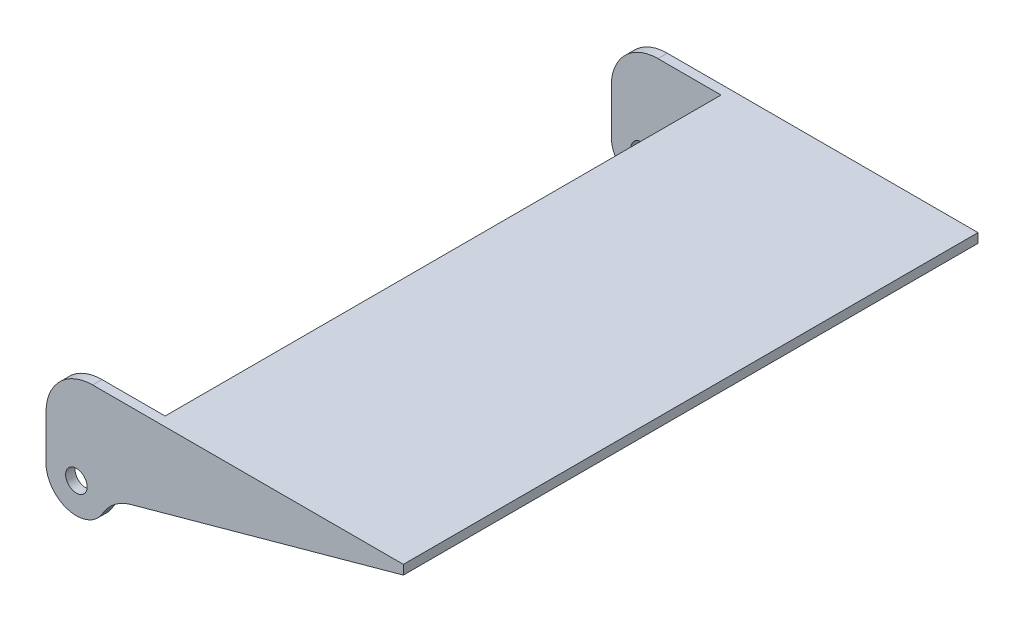
ISO-10303-21;
HEADER;
FILE_DESCRIPTION(('STEP AP214'),'2;1');
FILE_NAME('part.step','',(''),(''),'','','');
FILE_SCHEMA(('AUTOMOTIVE_DESIGN { 1 0 10303 214 1 1 1 1 }'));
ENDSEC;
DATA;
#1=APPLICATION_CONTEXT('core data for automotive mechanical design processes');
#2=APPLICATION_PROTOCOL_DEFINITION('international standard','automotive_design',2000,#1);
#3=PRODUCT_CONTEXT('',#1,'mechanical');
#4=PRODUCT('Part','Part','',(#3));
#5=PRODUCT_RELATED_PRODUCT_CATEGORY('part','',(#4));
#6=PRODUCT_DEFINITION_FORMATION('','',#4);
#7=PRODUCT_DEFINITION_CONTEXT('part definition',#1,'design');
#8=PRODUCT_DEFINITION('design','',#6,#7);
#9=PRODUCT_DEFINITION_SHAPE('','',#8);
#10=(LENGTH_UNIT() NAMED_UNIT(*) SI_UNIT(.MILLI.,.METRE.));
#11=(NAMED_UNIT(*) PLANE_ANGLE_UNIT() SI_UNIT($,.RADIAN.));
#12=(NAMED_UNIT(*) SI_UNIT($,.STERADIAN.) SOLID_ANGLE_UNIT());
#13=UNCERTAINTY_MEASURE_WITH_UNIT(LENGTH_MEASURE(1.E-05),#10,'distance_accuracy_value','');
#14=(GEOMETRIC_REPRESENTATION_CONTEXT(3) GLOBAL_UNCERTAINTY_ASSIGNED_CONTEXT((#13)) GLOBAL_UNIT_ASSIGNED_CONTEXT((#10,
#11,#12)) REPRESENTATION_CONTEXT('',''));
#15=CARTESIAN_POINT('',(0.,0.,0.));
#16=DIRECTION('',(0.,0.,1.));
#17=DIRECTION('',(1.,0.,0.));
#18=AXIS2_PLACEMENT_3D('',#15,#16,#17);
#19=CARTESIAN_POINT('',(-41.5004986708684,-8.,-142.298219213207));
#20=DIRECTION('',(0.,0.,1.));
#21=DIRECTION('',(1.,0.,0.));
#22=AXIS2_PLACEMENT_3D('',#19,#20,#21);
#23=CYLINDRICAL_SURFACE('',#22,10.);
#24=DIRECTION('',(0.,0.,1.));
#25=VECTOR('',#24,1.);
#26=CARTESIAN_POINT('',(-41.5004986708684,2.00000000000001,-142.298219213207));
#27=LINE('',#26,#25);
#28=CARTESIAN_POINT('',(-41.5004986708684,2.00000000000001,59.5));
#29=VERTEX_POINT('',#28);
#30=CARTESIAN_POINT('',(-41.5004986708684,2.00000000000001,61.5));
#31=VERTEX_POINT('',#30);
#32=EDGE_CURVE('E221',#29,#31,#27,.T.);
#33=ORIENTED_EDGE('',*,*,#32,.F.);
#34=CARTESIAN_POINT('',(-41.5004986708684,-8.,59.5));
#35=DIRECTION('',(0.,0.,1.));
#36=DIRECTION('',(1.,0.,0.));
#37=AXIS2_PLACEMENT_3D('',#34,#35,#36);
#38=CIRCLE('',#37,10.);
#39=CARTESIAN_POINT('',(-51.5004986708684,-8.,59.5));
#40=VERTEX_POINT('',#39);
#41=EDGE_CURVE('E182',#40,#29,#38,.F.);
#42=ORIENTED_EDGE('',*,*,#41,.F.);
#43=DIRECTION('',(0.,0.,1.));
#44=VECTOR('',#43,1.);
#45=CARTESIAN_POINT('',(-51.5004986708684,-8.,-142.298219213207));
#46=LINE('',#45,#44);
#47=CARTESIAN_POINT('',(-51.5004986708684,-8.,61.5));
#48=VERTEX_POINT('',#47);
#49=EDGE_CURVE('E217',#40,#48,#46,.T.);
#50=ORIENTED_EDGE('',*,*,#49,.T.);
#51=CARTESIAN_POINT('',(-41.5004986708684,-8.,61.5));
#52=DIRECTION('',(0.,0.,1.));
#53=DIRECTION('',(1.,0.,0.));
#54=AXIS2_PLACEMENT_3D('',#51,#52,#53);
#55=CIRCLE('',#54,10.);
#56=EDGE_CURVE('E204',#31,#48,#55,.T.);
#57=ORIENTED_EDGE('',*,*,#56,.F.);
#58=EDGE_LOOP('',(#33,#42,#50,#57));
#59=FACE_BOUND('',#58,.T.);
#60=ADVANCED_FACE('F33',(#59),#23,.T.);
#61=CARTESIAN_POINT('',(-45.,-17.5,-142.298219213207));
#62=DIRECTION('',(0.,0.,1.));
#63=DIRECTION('',(1.,0.,0.));
#64=AXIS2_PLACEMENT_3D('',#61,#62,#63);
#65=CYLINDRICAL_SURFACE('',#64,6.5004986708684);
#66=CARTESIAN_POINT('',(-45.,-17.5,59.5));
#67=DIRECTION('',(0.,0.,1.));
#68=DIRECTION('',(1.,0.,0.));
#69=AXIS2_PLACEMENT_3D('',#66,#67,#68);
#70=CIRCLE('',#69,6.5004986708684);
#71=CARTESIAN_POINT('',(-39.3638938716402,-20.7389490085253,59.5));
#72=VERTEX_POINT('',#71);
#73=CARTESIAN_POINT('',(-51.5004986708684,-17.5,59.5));
#74=VERTEX_POINT('',#73);
#75=EDGE_CURVE('E180',#72,#74,#70,.F.);
#76=ORIENTED_EDGE('',*,*,#75,.F.);
#77=DIRECTION('',(0.,0.,1.));
#78=VECTOR('',#77,1.);
#79=CARTESIAN_POINT('',(-39.3638938716402,-20.7389490085253,-142.298219213207));
#80=LINE('',#79,#78);
#81=CARTESIAN_POINT('',(-39.3638938716402,-20.7389490085253,61.5));
#82=VERTEX_POINT('',#81);
#83=EDGE_CURVE('E210',#72,#82,#80,.T.);
#84=ORIENTED_EDGE('',*,*,#83,.T.);
#85=CARTESIAN_POINT('',(-45.,-17.5,61.5));
#86=DIRECTION('',(0.,0.,1.));
#87=DIRECTION('',(1.,0.,0.));
#88=AXIS2_PLACEMENT_3D('',#85,#86,#87);
#89=CIRCLE('',#88,6.5004986708684);
#90=CARTESIAN_POINT('',(-51.5004986708684,-17.5,61.5));
#91=VERTEX_POINT('',#90);
#92=EDGE_CURVE('E184',#91,#82,#89,.T.);
#93=ORIENTED_EDGE('',*,*,#92,.F.);
#94=DIRECTION('',(0.,0.,1.));
#95=VECTOR('',#94,1.);
#96=CARTESIAN_POINT('',(-51.5004986708684,-17.5,-142.298219213207));
#97=LINE('',#96,#95);
#98=EDGE_CURVE('E213',#74,#91,#97,.T.);
#99=ORIENTED_EDGE('',*,*,#98,.F.);
#100=EDGE_LOOP('',(#76,#84,#93,#99));
#101=FACE_BOUND('',#100,.T.);
#102=ADVANCED_FACE('F310',(#101),#65,.T.);
#103=CARTESIAN_POINT('',(-51.5004986708684,-8.,-142.298219213207));
#104=DIRECTION('',(-1.,0.,0.));
#105=DIRECTION('',(0.,-1.,0.));
#106=AXIS2_PLACEMENT_3D('',#103,#104,#105);
#107=PLANE('',#106);
#108=DIRECTION('',(0.,-1.,0.));
#109=VECTOR('',#108,1.);
#110=CARTESIAN_POINT('',(-51.5004986708684,0.,59.5));
#111=LINE('',#110,#109);
#112=EDGE_CURVE('E171',#40,#74,#111,.T.);
#113=ORIENTED_EDGE('',*,*,#112,.T.);
#114=ORIENTED_EDGE('',*,*,#98,.T.);
#115=DIRECTION('',(0.,-1.,0.));
#116=VECTOR('',#115,1.);
#117=CARTESIAN_POINT('',(-51.5004986708684,-8.,61.5));
#118=LINE('',#117,#116);
#119=EDGE_CURVE('E207',#48,#91,#118,.T.);
#120=ORIENTED_EDGE('',*,*,#119,.F.);
#121=ORIENTED_EDGE('',*,*,#49,.F.);
#122=EDGE_LOOP('',(#113,#114,#120,#121));
#123=FACE_BOUND('',#122,.T.);
#124=ADVANCED_FACE('F316',(#123),#107,.T.);
#125=CARTESIAN_POINT('',(25.,0.,-142.298219213207));
#126=DIRECTION('',(0.265687680652756,-0.964059156042491,0.));
#127=DIRECTION('',(0.964059156042491,0.265687680652756,0.));
#128=AXIS2_PLACEMENT_3D('',#125,#126,#127);
#129=PLANE('',#128);
#130=DIRECTION('',(-0.964059156042491,-0.265687680652756,0.));
#131=VECTOR('',#130,1.);
#132=CARTESIAN_POINT('',(25.,0.,59.5));
#133=LINE('',#132,#131);
#134=CARTESIAN_POINT('',(25.,0.,59.5));
#135=VERTEX_POINT('',#134);
#136=CARTESIAN_POINT('',(-33.3505033437282,-16.0809736634385,59.5));
#137=VERTEX_POINT('',#136);
#138=EDGE_CURVE('E178',#135,#137,#133,.T.);
#139=ORIENTED_EDGE('',*,*,#138,.F.);
#140=DIRECTION('',(0.,0.,-1.));
#141=VECTOR('',#140,1.);
#142=CARTESIAN_POINT('',(25.,0.,61.5));
#143=LINE('',#142,#141);
#144=CARTESIAN_POINT('',(25.,0.,61.5));
#145=VERTEX_POINT('',#144);
#146=EDGE_CURVE('E234',#145,#135,#143,.T.);
#147=ORIENTED_EDGE('',*,*,#146,.F.);
#148=DIRECTION('',(0.96405915604249,0.265687680652756,0.));
#149=VECTOR('',#148,1.);
#150=CARTESIAN_POINT('',(25.,0.,61.5));
#151=LINE('',#150,#149);
#152=CARTESIAN_POINT('',(-33.3505033437282,-16.0809736634385,61.5));
#153=VERTEX_POINT('',#152);
#154=EDGE_CURVE('E201',#153,#145,#151,.T.);
#155=ORIENTED_EDGE('',*,*,#154,.F.);
#156=DIRECTION('',(0.,0.,1.));
#157=VECTOR('',#156,1.);
#158=CARTESIAN_POINT('',(-33.3505033437282,-16.0809736634385,-142.298219213207));
#159=LINE('',#158,#157);
#160=EDGE_CURVE('E225',#137,#153,#159,.T.);
#161=ORIENTED_EDGE('',*,*,#160,.F.);
#162=EDGE_LOOP('',(#139,#147,#155,#161));
#163=FACE_BOUND('',#162,.T.);
#164=ADVANCED_FACE('F327',(#163),#129,.T.);
#165=CARTESIAN_POINT('',(-30.6936265372007,-25.7215652238634,-142.298219213207));
#166=DIRECTION('',(0.,0.,1.));
#167=DIRECTION('',(1.,0.,0.));
#168=AXIS2_PLACEMENT_3D('',#165,#166,#167);
#169=CYLINDRICAL_SURFACE('',#168,10.);
#170=CARTESIAN_POINT('',(-30.6936265372007,-25.7215652238634,59.5));
#171=DIRECTION('',(0.,0.,1.));
#172=DIRECTION('',(1.,0.,0.));
#173=AXIS2_PLACEMENT_3D('',#170,#171,#172);
#174=CIRCLE('',#173,10.);
#175=EDGE_CURVE('E11',#137,#72,#174,.T.);
#176=ORIENTED_EDGE('',*,*,#175,.F.);
#177=ORIENTED_EDGE('',*,*,#160,.T.);
#178=CARTESIAN_POINT('',(-30.6936265372007,-25.7215652238634,61.5));
#179=DIRECTION('',(0.,0.,-1.));
#180=DIRECTION('',(-1.,0.,0.));
#181=AXIS2_PLACEMENT_3D('',#178,#179,#180);
#182=CIRCLE('',#181,10.);
#183=EDGE_CURVE('E198',#82,#153,#182,.T.);
#184=ORIENTED_EDGE('',*,*,#183,.F.);
#185=ORIENTED_EDGE('',*,*,#83,.F.);
#186=EDGE_LOOP('',(#176,#177,#184,#185));
#187=FACE_BOUND('',#186,.T.);
#188=ADVANCED_FACE('F337',(#187),#169,.F.);
#189=CARTESIAN_POINT('',(25.,2.,61.5));
#190=DIRECTION('',(-1.,0.,0.));
#191=DIRECTION('',(0.,0.,1.));
#192=AXIS2_PLACEMENT_3D('',#189,#190,#191);
#193=PLANE('',#192);
#194=ORIENTED_EDGE('',*,*,#146,.T.);
#195=DIRECTION('',(0.,0.,1.));
#196=VECTOR('',#195,1.);
#197=CARTESIAN_POINT('',(25.,0.,59.5));
#198=LINE('',#197,#196);
#199=CARTESIAN_POINT('',(25.,0.,-59.5));
#200=VERTEX_POINT('',#199);
#201=EDGE_CURVE('E273',#200,#135,#198,.T.);
#202=ORIENTED_EDGE('',*,*,#201,.F.);
#203=CARTESIAN_POINT('',(25.,0.,-61.5));
#204=VERTEX_POINT('',#203);
#205=EDGE_CURVE('E230',#200,#204,#143,.T.);
#206=ORIENTED_EDGE('',*,*,#205,.T.);
#207=DIRECTION('',(0.,-1.,0.));
#208=VECTOR('',#207,1.);
#209=CARTESIAN_POINT('',(25.,2.,-61.5));
#210=LINE('',#209,#208);
#211=CARTESIAN_POINT('',(25.,2.,-61.5));
#212=VERTEX_POINT('',#211);
#213=EDGE_CURVE('E242',#212,#204,#210,.T.);
#214=ORIENTED_EDGE('',*,*,#213,.F.);
#215=DIRECTION('',(0.,0.,-1.));
#216=VECTOR('',#215,1.);
#217=CARTESIAN_POINT('',(25.,2.,61.5));
#218=LINE('',#217,#216);
#219=CARTESIAN_POINT('',(25.,2.,61.5));
#220=VERTEX_POINT('',#219);
#221=EDGE_CURVE('E231',#220,#212,#218,.T.);
#222=ORIENTED_EDGE('',*,*,#221,.F.);
#223=DIRECTION('',(0.,-1.,0.));
#224=VECTOR('',#223,1.);
#225=CARTESIAN_POINT('',(25.,2.,61.5));
#226=LINE('',#225,#224);
#227=EDGE_CURVE('E237',#220,#145,#226,.T.);
#228=ORIENTED_EDGE('',*,*,#227,.T.);
#229=EDGE_LOOP('',(#194,#202,#206,#214,#222,#228));
#230=FACE_BOUND('',#229,.T.);
#231=ADVANCED_FACE('F35',(#230),#193,.F.);
#232=CARTESIAN_POINT('',(-25.,2.,-61.5));
#233=DIRECTION('',(0.,0.,1.));
#234=DIRECTION('',(1.,0.,0.));
#235=AXIS2_PLACEMENT_3D('',#232,#233,#234);
#236=PLANE('',#235);
#237=CARTESIAN_POINT('',(-45.,-17.5,-61.5));
#238=DIRECTION('',(0.,0.,1.));
#239=DIRECTION('',(1.,0.,0.));
#240=AXIS2_PLACEMENT_3D('',#237,#238,#239);
#241=CIRCLE('',#240,2.3);
#242=CARTESIAN_POINT('',(-42.7,-17.5,-61.5));
#243=VERTEX_POINT('',#242);
#244=EDGE_CURVE('E290',#243,#243,#241,.T.);
#245=ORIENTED_EDGE('',*,*,#244,.T.);
#246=EDGE_LOOP('',(#245));
#247=FACE_BOUND('',#246,.T.);
#248=ORIENTED_EDGE('',*,*,#213,.T.);
#249=DIRECTION('',(-0.964059156042491,-0.265687680652756,0.));
#250=VECTOR('',#249,1.);
#251=CARTESIAN_POINT('',(25.,0.,-61.5));
#252=LINE('',#251,#250);
#253=CARTESIAN_POINT('',(-33.3505033437282,-16.0809736634385,-61.5));
#254=VERTEX_POINT('',#253);
#255=EDGE_CURVE('E185',#204,#254,#252,.T.);
#256=ORIENTED_EDGE('',*,*,#255,.T.);
#257=CARTESIAN_POINT('',(-30.6936265372007,-25.7215652238634,-61.5));
#258=DIRECTION('',(0.,0.,1.));
#259=DIRECTION('',(1.,0.,0.));
#260=AXIS2_PLACEMENT_3D('',#257,#258,#259);
#261=CIRCLE('',#260,10.);
#262=CARTESIAN_POINT('',(-39.3638938716402,-20.7389490085253,-61.5));
#263=VERTEX_POINT('',#262);
#264=EDGE_CURVE('E195',#254,#263,#261,.T.);
#265=ORIENTED_EDGE('',*,*,#264,.T.);
#266=CARTESIAN_POINT('',(-45.,-17.5,-61.5));
#267=DIRECTION('',(0.,0.,1.));
#268=DIRECTION('',(1.,0.,0.));
#269=AXIS2_PLACEMENT_3D('',#266,#267,#268);
#270=CIRCLE('',#269,6.5004986708684);
#271=CARTESIAN_POINT('',(-51.5004986708684,-17.5,-61.5));
#272=VERTEX_POINT('',#271);
#273=EDGE_CURVE('E193',#263,#272,#270,.F.);
#274=ORIENTED_EDGE('',*,*,#273,.T.);
#275=DIRECTION('',(0.,1.,0.));
#276=VECTOR('',#275,1.);
#277=CARTESIAN_POINT('',(-51.5004986708684,-8.,-61.5));
#278=LINE('',#277,#276);
#279=CARTESIAN_POINT('',(-51.5004986708684,-8.,-61.5));
#280=VERTEX_POINT('',#279);
#281=EDGE_CURVE('E191',#272,#280,#278,.T.);
#282=ORIENTED_EDGE('',*,*,#281,.T.);
#283=CARTESIAN_POINT('',(-41.5004986708684,-8.,-61.5));
#284=DIRECTION('',(0.,0.,1.));
#285=DIRECTION('',(1.,0.,0.));
#286=AXIS2_PLACEMENT_3D('',#283,#284,#285);
#287=CIRCLE('',#286,10.);
#288=CARTESIAN_POINT('',(-41.5004986708684,2.,-61.5));
#289=VERTEX_POINT('',#288);
#290=EDGE_CURVE('E187',#280,#289,#287,.F.);
#291=ORIENTED_EDGE('',*,*,#290,.T.);
#292=DIRECTION('',(-1.,0.,0.));
#293=VECTOR('',#292,1.);
#294=CARTESIAN_POINT('',(-25.,2.,-61.5));
#295=LINE('',#294,#293);
#296=EDGE_CURVE('E233',#212,#289,#295,.T.);
#297=ORIENTED_EDGE('',*,*,#296,.F.);
#298=EDGE_LOOP('',(#248,#256,#265,#274,#282,#291,#297));
#299=FACE_BOUND('',#298,.T.);
#300=ADVANCED_FACE('F256',(#247,#299),#236,.F.);
#301=CARTESIAN_POINT('',(-25.,2.,61.5));
#302=DIRECTION('',(0.,0.,-1.));
#303=DIRECTION('',(-1.,0.,0.));
#304=AXIS2_PLACEMENT_3D('',#301,#302,#303);
#305=PLANE('',#304);
#306=CARTESIAN_POINT('',(-45.,-17.5,61.5));
#307=DIRECTION('',(0.,0.,-1.));
#308=DIRECTION('',(-1.,0.,0.));
#309=AXIS2_PLACEMENT_3D('',#306,#307,#308);
#310=CIRCLE('',#309,2.3);
#311=CARTESIAN_POINT('',(-47.3,-17.5,61.5));
#312=VERTEX_POINT('',#311);
#313=EDGE_CURVE('E153',#312,#312,#310,.T.);
#314=ORIENTED_EDGE('',*,*,#313,.T.);
#315=EDGE_LOOP('',(#314));
#316=FACE_BOUND('',#315,.T.);
#317=DIRECTION('',(1.,0.,0.));
#318=VECTOR('',#317,1.);
#319=CARTESIAN_POINT('',(-25.,2.,61.5));
#320=LINE('',#319,#318);
#321=EDGE_CURVE('E57',#31,#220,#320,.T.);
#322=ORIENTED_EDGE('',*,*,#321,.F.);
#323=ORIENTED_EDGE('',*,*,#56,.T.);
#324=ORIENTED_EDGE('',*,*,#119,.T.);
#325=ORIENTED_EDGE('',*,*,#92,.T.);
#326=ORIENTED_EDGE('',*,*,#183,.T.);
#327=ORIENTED_EDGE('',*,*,#154,.T.);
#328=ORIENTED_EDGE('',*,*,#227,.F.);
#329=EDGE_LOOP('',(#322,#323,#324,#325,#326,#327,#328));
#330=FACE_BOUND('',#329,.T.);
#331=ADVANCED_FACE('F348',(#316,#330),#305,.F.);
#332=CARTESIAN_POINT('',(0.,2.,0.));
#333=DIRECTION('',(0.,-1.,0.));
#334=DIRECTION('',(0.,0.,-1.));
#335=AXIS2_PLACEMENT_3D('',#332,#333,#334);
#336=PLANE('',#335);
#337=DIRECTION('',(0.,0.,1.));
#338=VECTOR('',#337,1.);
#339=CARTESIAN_POINT('',(-28.,2.,0.));
#340=LINE('',#339,#338);
#341=CARTESIAN_POINT('',(-28.,1.99999999999999,-59.5));
#342=VERTEX_POINT('',#341);
#343=CARTESIAN_POINT('',(-28.,1.99999999999999,59.5));
#344=VERTEX_POINT('',#343);
#345=EDGE_CURVE('E148',#342,#344,#340,.T.);
#346=ORIENTED_EDGE('',*,*,#345,.T.);
#347=DIRECTION('',(-1.,0.,0.));
#348=VECTOR('',#347,1.);
#349=CARTESIAN_POINT('',(0.,2.,59.5));
#350=LINE('',#349,#348);
#351=EDGE_CURVE('E275',#344,#29,#350,.T.);
#352=ORIENTED_EDGE('',*,*,#351,.T.);
#353=ORIENTED_EDGE('',*,*,#32,.T.);
#354=ORIENTED_EDGE('',*,*,#321,.T.);
#355=ORIENTED_EDGE('',*,*,#221,.T.);
#356=ORIENTED_EDGE('',*,*,#296,.T.);
#357=CARTESIAN_POINT('',(-41.5004986708684,2.00000000000001,-59.5));
#358=VERTEX_POINT('',#357);
#359=EDGE_CURVE('E218',#289,#358,#27,.T.);
#360=ORIENTED_EDGE('',*,*,#359,.T.);
#361=DIRECTION('',(1.,0.,0.));
#362=VECTOR('',#361,1.);
#363=CARTESIAN_POINT('',(0.,2.,-59.5));
#364=LINE('',#363,#362);
#365=EDGE_CURVE('E269',#358,#342,#364,.T.);
#366=ORIENTED_EDGE('',*,*,#365,.T.);
#367=EDGE_LOOP('',(#346,#352,#353,#354,#355,#356,#360,#366));
#368=FACE_BOUND('',#367,.T.);
#369=ADVANCED_FACE('F268',(#368),#336,.F.);
#370=CARTESIAN_POINT('',(-45.,-17.5,-59.5));
#371=DIRECTION('',(0.,0.,-1.));
#372=DIRECTION('',(-1.,0.,0.));
#373=AXIS2_PLACEMENT_3D('',#370,#371,#372);
#374=CIRCLE('',#373,6.5004986708684);
#375=CARTESIAN_POINT('',(-51.5004986708684,-17.5,-59.5));
#376=VERTEX_POINT('',#375);
#377=CARTESIAN_POINT('',(-39.3638938716402,-20.7389490085253,-59.5));
#378=VERTEX_POINT('',#377);
#379=EDGE_CURVE('E49',#376,#378,#374,.F.);
#380=ORIENTED_EDGE('',*,*,#379,.F.);
#381=EDGE_CURVE('E188',#272,#376,#97,.T.);
#382=ORIENTED_EDGE('',*,*,#381,.F.);
#383=ORIENTED_EDGE('',*,*,#273,.F.);
#384=EDGE_CURVE('E226',#263,#378,#80,.T.);
#385=ORIENTED_EDGE('',*,*,#384,.T.);
#386=EDGE_LOOP('',(#380,#382,#383,#385));
#387=FACE_BOUND('',#386,.T.);
#388=ADVANCED_FACE('F260',(#387),#65,.T.);
#389=DIRECTION('',(0.,1.,0.));
#390=VECTOR('',#389,1.);
#391=CARTESIAN_POINT('',(-51.5004986708684,0.,-59.5));
#392=LINE('',#391,#390);
#393=CARTESIAN_POINT('',(-51.5004986708684,-8.,-59.5));
#394=VERTEX_POINT('',#393);
#395=EDGE_CURVE('E167',#376,#394,#392,.T.);
#396=ORIENTED_EDGE('',*,*,#395,.T.);
#397=EDGE_CURVE('E214',#280,#394,#46,.T.);
#398=ORIENTED_EDGE('',*,*,#397,.F.);
#399=ORIENTED_EDGE('',*,*,#281,.F.);
#400=ORIENTED_EDGE('',*,*,#381,.T.);
#401=EDGE_LOOP('',(#396,#398,#399,#400));
#402=FACE_BOUND('',#401,.T.);
#403=ADVANCED_FACE('F262',(#402),#107,.T.);
#404=CARTESIAN_POINT('',(-41.5004986708684,-8.,-59.5));
#405=DIRECTION('',(0.,0.,-1.));
#406=DIRECTION('',(-1.,0.,0.));
#407=AXIS2_PLACEMENT_3D('',#404,#405,#406);
#408=CIRCLE('',#407,10.);
#409=EDGE_CURVE('E176',#358,#394,#408,.F.);
#410=ORIENTED_EDGE('',*,*,#409,.F.);
#411=ORIENTED_EDGE('',*,*,#359,.F.);
#412=ORIENTED_EDGE('',*,*,#290,.F.);
#413=ORIENTED_EDGE('',*,*,#397,.T.);
#414=EDGE_LOOP('',(#410,#411,#412,#413));
#415=FACE_BOUND('',#414,.T.);
#416=ADVANCED_FACE('F267',(#415),#23,.T.);
#417=DIRECTION('',(0.964059156042491,0.265687680652756,0.));
#418=VECTOR('',#417,1.);
#419=CARTESIAN_POINT('',(25.,0.,-59.5));
#420=LINE('',#419,#418);
#421=CARTESIAN_POINT('',(-33.3505033437282,-16.0809736634385,-59.5));
#422=VERTEX_POINT('',#421);
#423=EDGE_CURVE('E166',#422,#200,#420,.T.);
#424=ORIENTED_EDGE('',*,*,#423,.F.);
#425=EDGE_CURVE('E222',#254,#422,#159,.T.);
#426=ORIENTED_EDGE('',*,*,#425,.F.);
#427=ORIENTED_EDGE('',*,*,#255,.F.);
#428=ORIENTED_EDGE('',*,*,#205,.F.);
#429=EDGE_LOOP('',(#424,#426,#427,#428));
#430=FACE_BOUND('',#429,.T.);
#431=ADVANCED_FACE('F249',(#430),#129,.T.);
#432=CARTESIAN_POINT('',(-30.6936265372007,-25.7215652238634,-59.5));
#433=DIRECTION('',(0.,0.,-1.));
#434=DIRECTION('',(-1.,0.,0.));
#435=AXIS2_PLACEMENT_3D('',#432,#433,#434);
#436=CIRCLE('',#435,10.);
#437=EDGE_CURVE('E42',#378,#422,#436,.T.);
#438=ORIENTED_EDGE('',*,*,#437,.F.);
#439=ORIENTED_EDGE('',*,*,#384,.F.);
#440=ORIENTED_EDGE('',*,*,#264,.F.);
#441=ORIENTED_EDGE('',*,*,#425,.T.);
#442=EDGE_LOOP('',(#438,#439,#440,#441));
#443=FACE_BOUND('',#442,.T.);
#444=ADVANCED_FACE('F253',(#443),#169,.F.);
#445=CARTESIAN_POINT('',(-51.5004986708684,0.,59.5));
#446=DIRECTION('',(0.,0.,1.));
#447=DIRECTION('',(1.,0.,0.));
#448=AXIS2_PLACEMENT_3D('',#445,#446,#447);
#449=PLANE('',#448);
#450=CARTESIAN_POINT('',(-45.,-17.5,59.5));
#451=DIRECTION('',(0.,0.,1.));
#452=DIRECTION('',(1.,0.,0.));
#453=AXIS2_PLACEMENT_3D('',#450,#451,#452);
#454=CIRCLE('',#453,2.3);
#455=CARTESIAN_POINT('',(-42.7,-17.5,59.5));
#456=VERTEX_POINT('',#455);
#457=EDGE_CURVE('E287',#456,#456,#454,.T.);
#458=ORIENTED_EDGE('',*,*,#457,.T.);
#459=EDGE_LOOP('',(#458));
#460=FACE_BOUND('',#459,.T.);
#461=ORIENTED_EDGE('',*,*,#138,.T.);
#462=ORIENTED_EDGE('',*,*,#175,.T.);
#463=ORIENTED_EDGE('',*,*,#75,.T.);
#464=ORIENTED_EDGE('',*,*,#112,.F.);
#465=ORIENTED_EDGE('',*,*,#41,.T.);
#466=ORIENTED_EDGE('',*,*,#351,.F.);
#467=DIRECTION('',(0.,1.,0.));
#468=VECTOR('',#467,1.);
#469=CARTESIAN_POINT('',(-28.,-24.0004986708684,59.5));
#470=LINE('',#469,#468);
#471=CARTESIAN_POINT('',(-28.,0.,59.5));
#472=VERTEX_POINT('',#471);
#473=EDGE_CURVE('E152',#472,#344,#470,.T.);
#474=ORIENTED_EDGE('',*,*,#473,.F.);
#475=DIRECTION('',(1.,0.,0.));
#476=VECTOR('',#475,1.);
#477=CARTESIAN_POINT('',(-51.5004986708684,0.,59.5));
#478=LINE('',#477,#476);
#479=EDGE_CURVE('E162',#472,#135,#478,.T.);
#480=ORIENTED_EDGE('',*,*,#479,.T.);
#481=EDGE_LOOP('',(#461,#462,#463,#464,#465,#466,#474,#480));
#482=FACE_BOUND('',#481,.T.);
#483=ADVANCED_FACE('F350',(#460,#482),#449,.F.);
#484=CARTESIAN_POINT('',(-51.5004986708684,0.,59.5));
#485=DIRECTION('',(0.,1.,0.));
#486=DIRECTION('',(0.,0.,1.));
#487=AXIS2_PLACEMENT_3D('',#484,#485,#486);
#488=PLANE('',#487);
#489=ORIENTED_EDGE('',*,*,#479,.F.);
#490=DIRECTION('',(0.,0.,-1.));
#491=VECTOR('',#490,1.);
#492=CARTESIAN_POINT('',(-28.,0.,59.5));
#493=LINE('',#492,#491);
#494=CARTESIAN_POINT('',(-28.,0.,-59.5));
#495=VERTEX_POINT('',#494);
#496=EDGE_CURVE('E145',#472,#495,#493,.T.);
#497=ORIENTED_EDGE('',*,*,#496,.T.);
#498=DIRECTION('',(1.,0.,0.));
#499=VECTOR('',#498,1.);
#500=CARTESIAN_POINT('',(-51.5004986708684,0.,-59.5));
#501=LINE('',#500,#499);
#502=EDGE_CURVE('E160',#495,#200,#501,.T.);
#503=ORIENTED_EDGE('',*,*,#502,.T.);
#504=ORIENTED_EDGE('',*,*,#201,.T.);
#505=EDGE_LOOP('',(#489,#497,#503,#504));
#506=FACE_BOUND('',#505,.T.);
#507=ADVANCED_FACE('F158',(#506),#488,.F.);
#508=CARTESIAN_POINT('',(-51.5004986708684,0.,-59.5));
#509=DIRECTION('',(0.,0.,-1.));
#510=DIRECTION('',(-1.,0.,0.));
#511=AXIS2_PLACEMENT_3D('',#508,#509,#510);
#512=PLANE('',#511);
#513=CARTESIAN_POINT('',(-45.,-17.5,-59.5));
#514=DIRECTION('',(0.,0.,-1.));
#515=DIRECTION('',(-1.,0.,0.));
#516=AXIS2_PLACEMENT_3D('',#513,#514,#515);
#517=CIRCLE('',#516,2.3);
#518=CARTESIAN_POINT('',(-47.3,-17.5,-59.5));
#519=VERTEX_POINT('',#518);
#520=EDGE_CURVE('E37',#519,#519,#517,.T.);
#521=ORIENTED_EDGE('',*,*,#520,.T.);
#522=EDGE_LOOP('',(#521));
#523=FACE_BOUND('',#522,.T.);
#524=ORIENTED_EDGE('',*,*,#502,.F.);
#525=DIRECTION('',(0.,1.,0.));
#526=VECTOR('',#525,1.);
#527=CARTESIAN_POINT('',(-28.,-24.0004986708684,-59.5));
#528=LINE('',#527,#526);
#529=EDGE_CURVE('E141',#495,#342,#528,.T.);
#530=ORIENTED_EDGE('',*,*,#529,.T.);
#531=ORIENTED_EDGE('',*,*,#365,.F.);
#532=ORIENTED_EDGE('',*,*,#409,.T.);
#533=ORIENTED_EDGE('',*,*,#395,.F.);
#534=ORIENTED_EDGE('',*,*,#379,.T.);
#535=ORIENTED_EDGE('',*,*,#437,.T.);
#536=ORIENTED_EDGE('',*,*,#423,.T.);
#537=EDGE_LOOP('',(#524,#530,#531,#532,#533,#534,#535,#536));
#538=FACE_BOUND('',#537,.T.);
#539=ADVANCED_FACE('F164',(#523,#538),#512,.F.);
#540=CARTESIAN_POINT('',(-28.,-24.0004986708684,-59.5));
#541=DIRECTION('',(1.,0.,0.));
#542=DIRECTION('',(0.,0.,-1.));
#543=AXIS2_PLACEMENT_3D('',#540,#541,#542);
#544=PLANE('',#543);
#545=ORIENTED_EDGE('',*,*,#529,.F.);
#546=ORIENTED_EDGE('',*,*,#496,.F.);
#547=ORIENTED_EDGE('',*,*,#473,.T.);
#548=ORIENTED_EDGE('',*,*,#345,.F.);
#549=EDGE_LOOP('',(#545,#546,#547,#548));
#550=FACE_BOUND('',#549,.T.);
#551=ADVANCED_FACE('F143',(#550),#544,.F.);
#552=CARTESIAN_POINT('',(-45.,-17.5,-61.5));
#553=DIRECTION('',(0.,0.,1.));
#554=DIRECTION('',(1.,0.,0.));
#555=AXIS2_PLACEMENT_3D('',#552,#553,#554);
#556=CYLINDRICAL_SURFACE('',#555,2.3);
#557=ORIENTED_EDGE('',*,*,#244,.F.);
#558=EDGE_LOOP('',(#557));
#559=FACE_BOUND('',#558,.T.);
#560=ORIENTED_EDGE('',*,*,#520,.F.);
#561=EDGE_LOOP('',(#560));
#562=FACE_BOUND('',#561,.T.);
#563=ADVANCED_FACE('F298',(#559,#562),#556,.F.);
#564=ORIENTED_EDGE('',*,*,#457,.F.);
#565=EDGE_LOOP('',(#564));
#566=FACE_BOUND('',#565,.T.);
#567=ORIENTED_EDGE('',*,*,#313,.F.);
#568=EDGE_LOOP('',(#567));
#569=FACE_BOUND('',#568,.T.);
#570=ADVANCED_FACE('F300',(#566,#569),#556,.F.);
#571=CLOSED_SHELL('',(#60,#102,#124,#164,#188,#231,#300,#331,#369,#388,#403,#416,#431,#444,#483,
#507,#539,#551,#563,#570));
#572=MANIFOLD_SOLID_BREP('B2',#571);
#573=ADVANCED_BREP_SHAPE_REPRESENTATION('',(#18,#572),#14);
#574=SHAPE_DEFINITION_REPRESENTATION(#9,#573);
ENDSEC;
END-ISO-10303-21;
